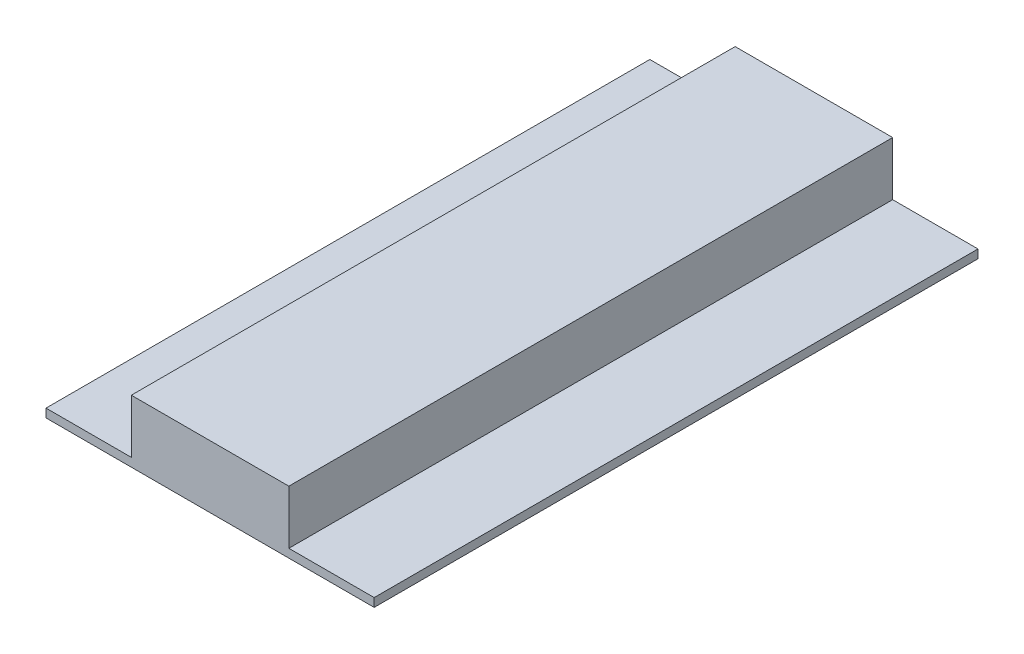
ISO-10303-21;
HEADER;
FILE_DESCRIPTION(('STEP AP214'),'2;1');
FILE_NAME('part.step','',(''),(''),'','','');
FILE_SCHEMA(('AUTOMOTIVE_DESIGN { 1 0 10303 214 1 1 1 1 }'));
ENDSEC;
DATA;
#1=APPLICATION_CONTEXT('core data for automotive mechanical design processes');
#2=APPLICATION_PROTOCOL_DEFINITION('international standard','automotive_design',2000,#1);
#3=PRODUCT_CONTEXT('',#1,'mechanical');
#4=PRODUCT('Part','Part','',(#3));
#5=PRODUCT_RELATED_PRODUCT_CATEGORY('part','',(#4));
#6=PRODUCT_DEFINITION_FORMATION('','',#4);
#7=PRODUCT_DEFINITION_CONTEXT('part definition',#1,'design');
#8=PRODUCT_DEFINITION('design','',#6,#7);
#9=PRODUCT_DEFINITION_SHAPE('','',#8);
#10=(LENGTH_UNIT() NAMED_UNIT(*) SI_UNIT(.MILLI.,.METRE.));
#11=(NAMED_UNIT(*) PLANE_ANGLE_UNIT() SI_UNIT($,.RADIAN.));
#12=(NAMED_UNIT(*) SI_UNIT($,.STERADIAN.) SOLID_ANGLE_UNIT());
#13=UNCERTAINTY_MEASURE_WITH_UNIT(LENGTH_MEASURE(1.E-05),#10,'distance_accuracy_value','');
#14=(GEOMETRIC_REPRESENTATION_CONTEXT(3) GLOBAL_UNCERTAINTY_ASSIGNED_CONTEXT((#13)) GLOBAL_UNIT_ASSIGNED_CONTEXT((#10,
#11,#12)) REPRESENTATION_CONTEXT('',''));
#15=CARTESIAN_POINT('',(0.,0.,0.));
#16=DIRECTION('',(0.,0.,1.));
#17=DIRECTION('',(1.,0.,0.));
#18=AXIS2_PLACEMENT_3D('',#15,#16,#17);
#19=CARTESIAN_POINT('',(12.,0.,46.));
#20=DIRECTION('',(1.,0.,0.));
#21=DIRECTION('',(0.,1.,0.));
#22=AXIS2_PLACEMENT_3D('',#19,#20,#21);
#23=PLANE('',#22);
#24=DIRECTION('',(0.,-1.,0.));
#25=VECTOR('',#24,1.);
#26=CARTESIAN_POINT('',(12.,0.,-46.));
#27=LINE('',#26,#25);
#28=CARTESIAN_POINT('',(12.,9.49999999999999,-46.));
#29=VERTEX_POINT('',#28);
#30=CARTESIAN_POINT('',(12.,1.29999999999999,-46.));
#31=VERTEX_POINT('',#30);
#32=EDGE_CURVE('E111',#29,#31,#27,.T.);
#33=ORIENTED_EDGE('',*,*,#32,.F.);
#34=DIRECTION('',(0.,0.,-1.));
#35=VECTOR('',#34,1.);
#36=CARTESIAN_POINT('',(12.,9.49999999999999,46.));
#37=LINE('',#36,#35);
#38=CARTESIAN_POINT('',(12.,9.49999999999999,46.));
#39=VERTEX_POINT('',#38);
#40=EDGE_CURVE('E11',#39,#29,#37,.T.);
#41=ORIENTED_EDGE('',*,*,#40,.F.);
#42=DIRECTION('',(0.,-1.,0.));
#43=VECTOR('',#42,1.);
#44=CARTESIAN_POINT('',(12.,0.,46.));
#45=LINE('',#44,#43);
#46=CARTESIAN_POINT('',(12.,1.29999999999999,46.));
#47=VERTEX_POINT('',#46);
#48=EDGE_CURVE('E151',#39,#47,#45,.T.);
#49=ORIENTED_EDGE('',*,*,#48,.T.);
#50=DIRECTION('',(0.,0.,-1.));
#51=VECTOR('',#50,1.);
#52=CARTESIAN_POINT('',(12.,1.29999999999999,46.));
#53=LINE('',#52,#51);
#54=EDGE_CURVE('E56',#47,#31,#53,.T.);
#55=ORIENTED_EDGE('',*,*,#54,.T.);
#56=EDGE_LOOP('',(#33,#41,#49,#55));
#57=FACE_BOUND('',#56,.T.);
#58=ADVANCED_FACE('F37',(#57),#23,.T.);
#59=CARTESIAN_POINT('',(0.,9.49999999999999,46.));
#60=DIRECTION('',(0.,1.,0.));
#61=DIRECTION('',(0.,0.,1.));
#62=AXIS2_PLACEMENT_3D('',#59,#60,#61);
#63=PLANE('',#62);
#64=DIRECTION('',(1.,0.,0.));
#65=VECTOR('',#64,1.);
#66=CARTESIAN_POINT('',(0.,9.49999999999999,-46.));
#67=LINE('',#66,#65);
#68=CARTESIAN_POINT('',(-12.,9.49999999999999,-46.));
#69=VERTEX_POINT('',#68);
#70=EDGE_CURVE('E152',#69,#29,#67,.T.);
#71=ORIENTED_EDGE('',*,*,#70,.F.);
#72=DIRECTION('',(0.,0.,-1.));
#73=VECTOR('',#72,1.);
#74=CARTESIAN_POINT('',(-12.,9.49999999999999,46.));
#75=LINE('',#74,#73);
#76=CARTESIAN_POINT('',(-12.,9.49999999999999,46.));
#77=VERTEX_POINT('',#76);
#78=EDGE_CURVE('E47',#77,#69,#75,.T.);
#79=ORIENTED_EDGE('',*,*,#78,.F.);
#80=DIRECTION('',(1.,0.,0.));
#81=VECTOR('',#80,1.);
#82=CARTESIAN_POINT('',(0.,9.49999999999999,46.));
#83=LINE('',#82,#81);
#84=EDGE_CURVE('E158',#77,#39,#83,.T.);
#85=ORIENTED_EDGE('',*,*,#84,.T.);
#86=ORIENTED_EDGE('',*,*,#40,.T.);
#87=EDGE_LOOP('',(#71,#79,#85,#86));
#88=FACE_BOUND('',#87,.T.);
#89=ADVANCED_FACE('F172',(#88),#63,.T.);
#90=CARTESIAN_POINT('',(-12.,0.,46.));
#91=DIRECTION('',(1.,0.,0.));
#92=DIRECTION('',(0.,1.,0.));
#93=AXIS2_PLACEMENT_3D('',#90,#91,#92);
#94=PLANE('',#93);
#95=DIRECTION('',(0.,-1.,0.));
#96=VECTOR('',#95,1.);
#97=CARTESIAN_POINT('',(-12.,0.,-46.));
#98=LINE('',#97,#96);
#99=CARTESIAN_POINT('',(-12.,1.29999999999999,-46.));
#100=VERTEX_POINT('',#99);
#101=EDGE_CURVE('E148',#69,#100,#98,.T.);
#102=ORIENTED_EDGE('',*,*,#101,.T.);
#103=DIRECTION('',(0.,0.,-1.));
#104=VECTOR('',#103,1.);
#105=CARTESIAN_POINT('',(-12.,1.29999999999999,46.));
#106=LINE('',#105,#104);
#107=CARTESIAN_POINT('',(-12.,1.29999999999999,46.));
#108=VERTEX_POINT('',#107);
#109=EDGE_CURVE('E144',#108,#100,#106,.T.);
#110=ORIENTED_EDGE('',*,*,#109,.F.);
#111=DIRECTION('',(0.,-1.,0.));
#112=VECTOR('',#111,1.);
#113=CARTESIAN_POINT('',(-12.,0.,46.));
#114=LINE('',#113,#112);
#115=EDGE_CURVE('E147',#77,#108,#114,.T.);
#116=ORIENTED_EDGE('',*,*,#115,.F.);
#117=ORIENTED_EDGE('',*,*,#78,.T.);
#118=EDGE_LOOP('',(#102,#110,#116,#117));
#119=FACE_BOUND('',#118,.T.);
#120=ADVANCED_FACE('F176',(#119),#94,.F.);
#121=CARTESIAN_POINT('',(0.,0.,46.));
#122=DIRECTION('',(0.,0.,1.));
#123=DIRECTION('',(1.,0.,0.));
#124=AXIS2_PLACEMENT_3D('',#121,#122,#123);
#125=PLANE('',#124);
#126=ORIENTED_EDGE('',*,*,#48,.F.);
#127=ORIENTED_EDGE('',*,*,#84,.F.);
#128=ORIENTED_EDGE('',*,*,#115,.T.);
#129=DIRECTION('',(1.,0.,0.));
#130=VECTOR('',#129,1.);
#131=CARTESIAN_POINT('',(-25.,1.29999999999999,46.));
#132=LINE('',#131,#130);
#133=CARTESIAN_POINT('',(-25.,1.29999999999999,46.));
#134=VERTEX_POINT('',#133);
#135=EDGE_CURVE('E137',#134,#108,#132,.T.);
#136=ORIENTED_EDGE('',*,*,#135,.F.);
#137=DIRECTION('',(0.,1.,0.));
#138=VECTOR('',#137,1.);
#139=CARTESIAN_POINT('',(-25.,0.,46.));
#140=LINE('',#139,#138);
#141=CARTESIAN_POINT('',(-25.,0.,46.));
#142=VERTEX_POINT('',#141);
#143=EDGE_CURVE('E120',#142,#134,#140,.T.);
#144=ORIENTED_EDGE('',*,*,#143,.F.);
#145=DIRECTION('',(1.,0.,0.));
#146=VECTOR('',#145,1.);
#147=CARTESIAN_POINT('',(-25.,0.,46.));
#148=LINE('',#147,#146);
#149=CARTESIAN_POINT('',(25.,0.,46.));
#150=VERTEX_POINT('',#149);
#151=EDGE_CURVE('E106',#142,#150,#148,.T.);
#152=ORIENTED_EDGE('',*,*,#151,.T.);
#153=DIRECTION('',(0.,-1.,0.));
#154=VECTOR('',#153,1.);
#155=CARTESIAN_POINT('',(25.,1.29999999999999,46.));
#156=LINE('',#155,#154);
#157=CARTESIAN_POINT('',(25.,1.29999999999999,46.));
#158=VERTEX_POINT('',#157);
#159=EDGE_CURVE('E134',#158,#150,#156,.T.);
#160=ORIENTED_EDGE('',*,*,#159,.F.);
#161=EDGE_CURVE('E139',#47,#158,#132,.T.);
#162=ORIENTED_EDGE('',*,*,#161,.F.);
#163=EDGE_LOOP('',(#126,#127,#128,#136,#144,#152,#160,#162));
#164=FACE_BOUND('',#163,.T.);
#165=ADVANCED_FACE('F167',(#164),#125,.T.);
#166=CARTESIAN_POINT('',(0.,0.,-46.));
#167=DIRECTION('',(0.,0.,1.));
#168=DIRECTION('',(1.,0.,0.));
#169=AXIS2_PLACEMENT_3D('',#166,#167,#168);
#170=PLANE('',#169);
#171=ORIENTED_EDGE('',*,*,#32,.T.);
#172=DIRECTION('',(1.,0.,0.));
#173=VECTOR('',#172,1.);
#174=CARTESIAN_POINT('',(-25.,1.29999999999999,-46.));
#175=LINE('',#174,#173);
#176=CARTESIAN_POINT('',(25.,1.29999999999999,-46.));
#177=VERTEX_POINT('',#176);
#178=EDGE_CURVE('E123',#31,#177,#175,.T.);
#179=ORIENTED_EDGE('',*,*,#178,.T.);
#180=DIRECTION('',(0.,-1.,0.));
#181=VECTOR('',#180,1.);
#182=CARTESIAN_POINT('',(25.,1.29999999999999,-46.));
#183=LINE('',#182,#181);
#184=CARTESIAN_POINT('',(25.,0.,-46.));
#185=VERTEX_POINT('',#184);
#186=EDGE_CURVE('E119',#177,#185,#183,.T.);
#187=ORIENTED_EDGE('',*,*,#186,.T.);
#188=DIRECTION('',(1.,0.,0.));
#189=VECTOR('',#188,1.);
#190=CARTESIAN_POINT('',(-25.,0.,-46.));
#191=LINE('',#190,#189);
#192=CARTESIAN_POINT('',(-25.,0.,-46.));
#193=VERTEX_POINT('',#192);
#194=EDGE_CURVE('E104',#193,#185,#191,.T.);
#195=ORIENTED_EDGE('',*,*,#194,.F.);
#196=DIRECTION('',(0.,1.,0.));
#197=VECTOR('',#196,1.);
#198=CARTESIAN_POINT('',(-25.,0.,-46.));
#199=LINE('',#198,#197);
#200=CARTESIAN_POINT('',(-25.,1.29999999999999,-46.));
#201=VERTEX_POINT('',#200);
#202=EDGE_CURVE('E118',#193,#201,#199,.T.);
#203=ORIENTED_EDGE('',*,*,#202,.T.);
#204=EDGE_CURVE('E125',#201,#100,#175,.T.);
#205=ORIENTED_EDGE('',*,*,#204,.T.);
#206=ORIENTED_EDGE('',*,*,#101,.F.);
#207=ORIENTED_EDGE('',*,*,#70,.T.);
#208=EDGE_LOOP('',(#171,#179,#187,#195,#203,#205,#206,#207));
#209=FACE_BOUND('',#208,.T.);
#210=ADVANCED_FACE('F116',(#209),#170,.F.);
#211=CARTESIAN_POINT('',(-25.,0.,46.));
#212=DIRECTION('',(0.,1.,0.));
#213=DIRECTION('',(0.,0.,1.));
#214=AXIS2_PLACEMENT_3D('',#211,#212,#213);
#215=PLANE('',#214);
#216=ORIENTED_EDGE('',*,*,#194,.T.);
#217=DIRECTION('',(0.,0.,-1.));
#218=VECTOR('',#217,1.);
#219=CARTESIAN_POINT('',(25.,0.,46.));
#220=LINE('',#219,#218);
#221=EDGE_CURVE('E96',#150,#185,#220,.T.);
#222=ORIENTED_EDGE('',*,*,#221,.F.);
#223=ORIENTED_EDGE('',*,*,#151,.F.);
#224=DIRECTION('',(0.,0.,-1.));
#225=VECTOR('',#224,1.);
#226=CARTESIAN_POINT('',(-25.,0.,46.));
#227=LINE('',#226,#225);
#228=EDGE_CURVE('E101',#142,#193,#227,.T.);
#229=ORIENTED_EDGE('',*,*,#228,.T.);
#230=EDGE_LOOP('',(#216,#222,#223,#229));
#231=FACE_BOUND('',#230,.T.);
#232=ADVANCED_FACE('F103',(#231),#215,.F.);
#233=CARTESIAN_POINT('',(25.,1.29999999999999,46.));
#234=DIRECTION('',(1.,0.,0.));
#235=DIRECTION('',(0.,0.,-1.));
#236=AXIS2_PLACEMENT_3D('',#233,#234,#235);
#237=PLANE('',#236);
#238=ORIENTED_EDGE('',*,*,#186,.F.);
#239=DIRECTION('',(0.,0.,-1.));
#240=VECTOR('',#239,1.);
#241=CARTESIAN_POINT('',(25.,1.29999999999999,46.));
#242=LINE('',#241,#240);
#243=EDGE_CURVE('E131',#158,#177,#242,.T.);
#244=ORIENTED_EDGE('',*,*,#243,.F.);
#245=ORIENTED_EDGE('',*,*,#159,.T.);
#246=ORIENTED_EDGE('',*,*,#221,.T.);
#247=EDGE_LOOP('',(#238,#244,#245,#246));
#248=FACE_BOUND('',#247,.T.);
#249=ADVANCED_FACE('F185',(#248),#237,.T.);
#250=CARTESIAN_POINT('',(-25.,0.,46.));
#251=DIRECTION('',(-1.,0.,0.));
#252=DIRECTION('',(0.,0.,1.));
#253=AXIS2_PLACEMENT_3D('',#250,#251,#252);
#254=PLANE('',#253);
#255=ORIENTED_EDGE('',*,*,#202,.F.);
#256=ORIENTED_EDGE('',*,*,#228,.F.);
#257=ORIENTED_EDGE('',*,*,#143,.T.);
#258=DIRECTION('',(0.,0.,-1.));
#259=VECTOR('',#258,1.);
#260=CARTESIAN_POINT('',(-25.,1.29999999999999,46.));
#261=LINE('',#260,#259);
#262=EDGE_CURVE('E41',#134,#201,#261,.T.);
#263=ORIENTED_EDGE('',*,*,#262,.T.);
#264=EDGE_LOOP('',(#255,#256,#257,#263));
#265=FACE_BOUND('',#264,.T.);
#266=ADVANCED_FACE('F39',(#265),#254,.T.);
#267=CARTESIAN_POINT('',(-25.,1.29999999999999,46.));
#268=DIRECTION('',(0.,1.,0.));
#269=DIRECTION('',(0.,0.,1.));
#270=AXIS2_PLACEMENT_3D('',#267,#268,#269);
#271=PLANE('',#270);
#272=ORIENTED_EDGE('',*,*,#135,.T.);
#273=ORIENTED_EDGE('',*,*,#109,.T.);
#274=ORIENTED_EDGE('',*,*,#204,.F.);
#275=ORIENTED_EDGE('',*,*,#262,.F.);
#276=EDGE_LOOP('',(#272,#273,#274,#275));
#277=FACE_BOUND('',#276,.T.);
#278=ADVANCED_FACE('F179',(#277),#271,.T.);
#279=ORIENTED_EDGE('',*,*,#54,.F.);
#280=ORIENTED_EDGE('',*,*,#161,.T.);
#281=ORIENTED_EDGE('',*,*,#243,.T.);
#282=ORIENTED_EDGE('',*,*,#178,.F.);
#283=EDGE_LOOP('',(#279,#280,#281,#282));
#284=FACE_BOUND('',#283,.T.);
#285=ADVANCED_FACE('F180',(#284),#271,.T.);
#286=CLOSED_SHELL('',(#58,#89,#120,#165,#210,#232,#249,#266,#278,#285));
#287=MANIFOLD_SOLID_BREP('B2',#286);
#288=ADVANCED_BREP_SHAPE_REPRESENTATION('',(#18,#287),#14);
#289=SHAPE_DEFINITION_REPRESENTATION(#9,#288);
ENDSEC;
END-ISO-10303-21;
